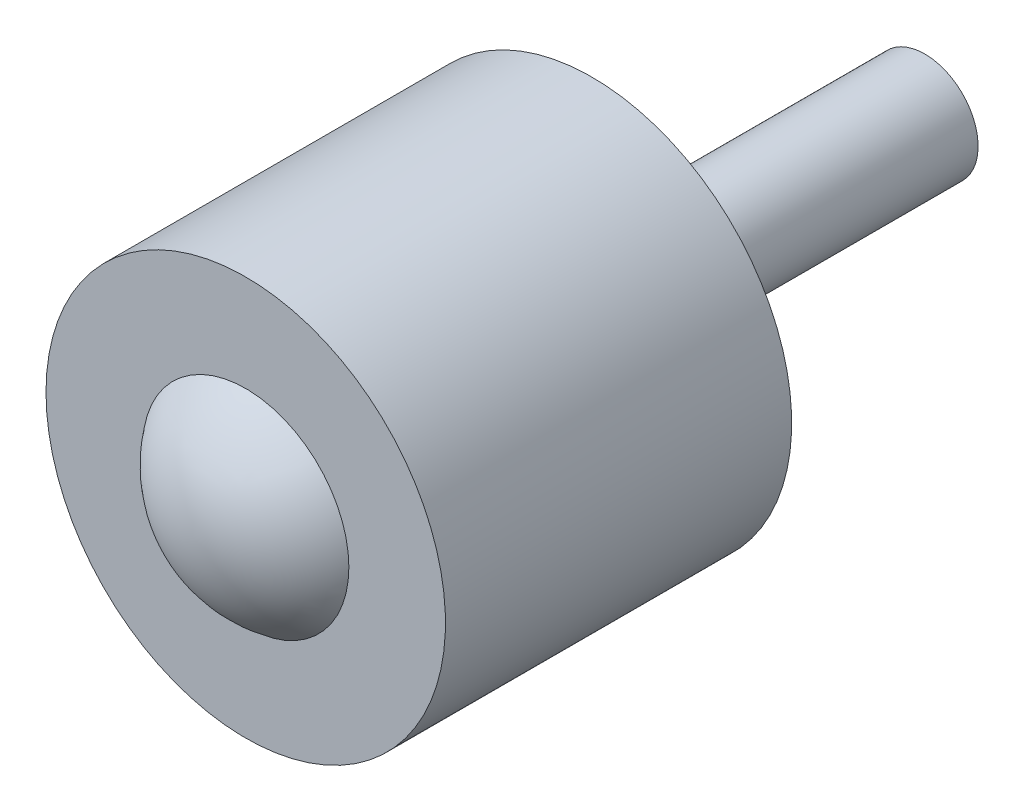
ISO-10303-21;
HEADER;
FILE_DESCRIPTION(('STEP AP214'),'2;1');
FILE_NAME('part.step','',(''),(''),'','','');
FILE_SCHEMA(('AUTOMOTIVE_DESIGN { 1 0 10303 214 1 1 1 1 }'));
ENDSEC;
DATA;
#1=APPLICATION_CONTEXT('core data for automotive mechanical design processes');
#2=APPLICATION_PROTOCOL_DEFINITION('international standard','automotive_design',2000,#1);
#3=PRODUCT_CONTEXT('',#1,'mechanical');
#4=PRODUCT('Part','Part','',(#3));
#5=PRODUCT_RELATED_PRODUCT_CATEGORY('part','',(#4));
#6=PRODUCT_DEFINITION_FORMATION('','',#4);
#7=PRODUCT_DEFINITION_CONTEXT('part definition',#1,'design');
#8=PRODUCT_DEFINITION('design','',#6,#7);
#9=PRODUCT_DEFINITION_SHAPE('','',#8);
#10=(LENGTH_UNIT() NAMED_UNIT(*) SI_UNIT(.MILLI.,.METRE.));
#11=(NAMED_UNIT(*) PLANE_ANGLE_UNIT() SI_UNIT($,.RADIAN.));
#12=(NAMED_UNIT(*) SI_UNIT($,.STERADIAN.) SOLID_ANGLE_UNIT());
#13=UNCERTAINTY_MEASURE_WITH_UNIT(LENGTH_MEASURE(1.E-05),#10,'distance_accuracy_value','');
#14=(GEOMETRIC_REPRESENTATION_CONTEXT(3) GLOBAL_UNCERTAINTY_ASSIGNED_CONTEXT((#13)) GLOBAL_UNIT_ASSIGNED_CONTEXT((#10,
#11,#12)) REPRESENTATION_CONTEXT('',''));
#15=CARTESIAN_POINT('',(0.,0.,0.));
#16=DIRECTION('',(0.,0.,1.));
#17=DIRECTION('',(1.,0.,0.));
#18=AXIS2_PLACEMENT_3D('',#15,#16,#17);
#19=CARTESIAN_POINT('',(0.,0.,0.));
#20=DIRECTION('',(0.,0.,-1.));
#21=DIRECTION('',(1.,0.,0.));
#22=AXIS2_PLACEMENT_3D('',#19,#20,#21);
#23=SPHERICAL_SURFACE('',#22,9.5);
#24=CARTESIAN_POINT('',(0.,0.,5.49999999999999));
#25=DIRECTION('',(0.,0.,1.));
#26=DIRECTION('',(1.,0.,0.));
#27=AXIS2_PLACEMENT_3D('',#24,#25,#26);
#28=CIRCLE('',#27,7.74596669241484);
#29=CARTESIAN_POINT('',(7.74596669241484,0.,5.49999999999998));
#30=VERTEX_POINT('',#29);
#31=EDGE_CURVE('E40',#30,#30,#28,.F.);
#32=ORIENTED_EDGE('',*,*,#31,.F.);
#33=EDGE_LOOP('',(#32));
#34=FACE_BOUND('',#33,.T.);
#35=ADVANCED_FACE('F37',(#34),#23,.T.);
#36=CARTESIAN_POINT('',(0.,0.,-20.5));
#37=DIRECTION('',(0.,0.,1.));
#38=DIRECTION('',(1.,0.,0.));
#39=AXIS2_PLACEMENT_3D('',#36,#37,#38);
#40=PLANE('',#39);
#41=CARTESIAN_POINT('',(0.,0.,-20.5));
#42=DIRECTION('',(0.,0.,-1.));
#43=DIRECTION('',(-1.,0.,0.));
#44=AXIS2_PLACEMENT_3D('',#41,#42,#43);
#45=CIRCLE('',#44,4.);
#46=CARTESIAN_POINT('',(-4.00000000000002,0.,-20.5));
#47=VERTEX_POINT('',#46);
#48=EDGE_CURVE('E10',#47,#47,#45,.T.);
#49=ORIENTED_EDGE('',*,*,#48,.F.);
#50=EDGE_LOOP('',(#49));
#51=FACE_BOUND('',#50,.T.);
#52=CARTESIAN_POINT('',(0.,0.,-20.5));
#53=DIRECTION('',(0.,0.,-1.));
#54=DIRECTION('',(-1.,0.,0.));
#55=AXIS2_PLACEMENT_3D('',#52,#53,#54);
#56=CIRCLE('',#55,15.);
#57=CARTESIAN_POINT('',(-15.,0.,-20.5));
#58=VERTEX_POINT('',#57);
#59=EDGE_CURVE('E50',#58,#58,#56,.T.);
#60=ORIENTED_EDGE('',*,*,#59,.T.);
#61=EDGE_LOOP('',(#60));
#62=FACE_BOUND('',#61,.T.);
#63=ADVANCED_FACE('F61',(#51,#62),#40,.F.);
#64=CARTESIAN_POINT('',(0.,0.,-20.5));
#65=DIRECTION('',(0.,0.,-1.));
#66=DIRECTION('',(-1.,0.,0.));
#67=AXIS2_PLACEMENT_3D('',#64,#65,#66);
#68=CYLINDRICAL_SURFACE('',#67,15.);
#69=CARTESIAN_POINT('',(0.,0.,5.49999999999999));
#70=DIRECTION('',(0.,0.,-1.));
#71=DIRECTION('',(-1.,0.,0.));
#72=AXIS2_PLACEMENT_3D('',#69,#70,#71);
#73=CIRCLE('',#72,15.);
#74=CARTESIAN_POINT('',(-15.,0.,5.5));
#75=VERTEX_POINT('',#74);
#76=EDGE_CURVE('E54',#75,#75,#73,.T.);
#77=ORIENTED_EDGE('',*,*,#76,.T.);
#78=EDGE_LOOP('',(#77));
#79=FACE_BOUND('',#78,.T.);
#80=ORIENTED_EDGE('',*,*,#59,.F.);
#81=EDGE_LOOP('',(#80));
#82=FACE_BOUND('',#81,.T.);
#83=ADVANCED_FACE('F63',(#79,#82),#68,.T.);
#84=CARTESIAN_POINT('',(0.,0.,5.49999999999999));
#85=DIRECTION('',(0.,0.,1.));
#86=DIRECTION('',(1.,0.,0.));
#87=AXIS2_PLACEMENT_3D('',#84,#85,#86);
#88=PLANE('',#87);
#89=ORIENTED_EDGE('',*,*,#31,.T.);
#90=EDGE_LOOP('',(#89));
#91=FACE_BOUND('',#90,.T.);
#92=ORIENTED_EDGE('',*,*,#76,.F.);
#93=EDGE_LOOP('',(#92));
#94=FACE_BOUND('',#93,.T.);
#95=ADVANCED_FACE('F65',(#91,#94),#88,.T.);
#96=CARTESIAN_POINT('',(0.,0.,-45.5));
#97=DIRECTION('',(0.,0.,1.));
#98=DIRECTION('',(1.,0.,0.));
#99=AXIS2_PLACEMENT_3D('',#96,#97,#98);
#100=CYLINDRICAL_SURFACE('',#99,4.);
#101=CARTESIAN_POINT('',(0.,0.,-45.5));
#102=DIRECTION('',(0.,0.,-1.));
#103=DIRECTION('',(-1.,0.,0.));
#104=AXIS2_PLACEMENT_3D('',#101,#102,#103);
#105=CIRCLE('',#104,4.);
#106=CARTESIAN_POINT('',(-4.00000000000004,0.,-45.5));
#107=VERTEX_POINT('',#106);
#108=EDGE_CURVE('E53',#107,#107,#105,.T.);
#109=ORIENTED_EDGE('',*,*,#108,.F.);
#110=EDGE_LOOP('',(#109));
#111=FACE_BOUND('',#110,.T.);
#112=ORIENTED_EDGE('',*,*,#48,.T.);
#113=EDGE_LOOP('',(#112));
#114=FACE_BOUND('',#113,.T.);
#115=ADVANCED_FACE('F72',(#111,#114),#100,.T.);
#116=CARTESIAN_POINT('',(0.,0.,-45.5));
#117=DIRECTION('',(0.,0.,-1.));
#118=DIRECTION('',(-1.,0.,0.));
#119=AXIS2_PLACEMENT_3D('',#116,#117,#118);
#120=PLANE('',#119);
#121=ORIENTED_EDGE('',*,*,#108,.T.);
#122=EDGE_LOOP('',(#121));
#123=FACE_BOUND('',#122,.T.);
#124=ADVANCED_FACE('F100',(#123),#120,.T.);
#125=CLOSED_SHELL('',(#35,#63,#83,#95,#115,#124));
#126=MANIFOLD_SOLID_BREP('B2',#125);
#127=ADVANCED_BREP_SHAPE_REPRESENTATION('',(#18,#126),#14);
#128=SHAPE_DEFINITION_REPRESENTATION(#9,#127);
ENDSEC;
END-ISO-10303-21;
